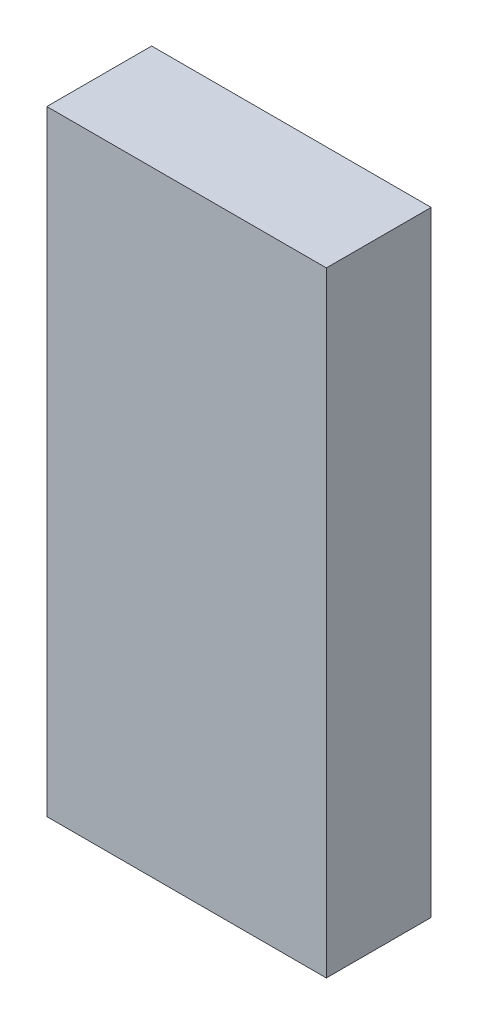
ISO-10303-21;
HEADER;
FILE_DESCRIPTION(('STEP AP214'),'2;1');
FILE_NAME('part.step','',(''),(''),'','','');
FILE_SCHEMA(('AUTOMOTIVE_DESIGN { 1 0 10303 214 1 1 1 1 }'));
ENDSEC;
DATA;
#1=APPLICATION_CONTEXT('core data for automotive mechanical design processes');
#2=APPLICATION_PROTOCOL_DEFINITION('international standard','automotive_design',2000,#1);
#3=PRODUCT_CONTEXT('',#1,'mechanical');
#4=PRODUCT('Part','Part','',(#3));
#5=PRODUCT_RELATED_PRODUCT_CATEGORY('part','',(#4));
#6=PRODUCT_DEFINITION_FORMATION('','',#4);
#7=PRODUCT_DEFINITION_CONTEXT('part definition',#1,'design');
#8=PRODUCT_DEFINITION('design','',#6,#7);
#9=PRODUCT_DEFINITION_SHAPE('','',#8);
#10=(LENGTH_UNIT() NAMED_UNIT(*) SI_UNIT(.MILLI.,.METRE.));
#11=(NAMED_UNIT(*) PLANE_ANGLE_UNIT() SI_UNIT($,.RADIAN.));
#12=(NAMED_UNIT(*) SI_UNIT($,.STERADIAN.) SOLID_ANGLE_UNIT());
#13=UNCERTAINTY_MEASURE_WITH_UNIT(LENGTH_MEASURE(1.E-05),#10,'distance_accuracy_value','');
#14=(GEOMETRIC_REPRESENTATION_CONTEXT(3) GLOBAL_UNCERTAINTY_ASSIGNED_CONTEXT((#13)) GLOBAL_UNIT_ASSIGNED_CONTEXT((#10,
#11,#12)) REPRESENTATION_CONTEXT('',''));
#15=CARTESIAN_POINT('',(0.,0.,0.));
#16=DIRECTION('',(0.,0.,1.));
#17=DIRECTION('',(1.,0.,0.));
#18=AXIS2_PLACEMENT_3D('',#15,#16,#17);
#19=CARTESIAN_POINT('',(-0.583606558012704,4.77383413269724,1.5));
#20=DIRECTION('',(1.,0.,0.));
#21=DIRECTION('',(0.,0.,-1.));
#22=AXIS2_PLACEMENT_3D('',#19,#20,#21);
#23=PLANE('',#22);
#24=DIRECTION('',(0.,-1.,0.));
#25=VECTOR('',#24,1.);
#26=CARTESIAN_POINT('',(-0.583606558012704,4.77383413269724,0.));
#27=LINE('',#26,#25);
#28=CARTESIAN_POINT('',(-0.583606558012704,4.77383413269724,0.));
#29=VERTEX_POINT('',#28);
#30=CARTESIAN_POINT('',(-0.583606558012704,-4.02616586730277,0.));
#31=VERTEX_POINT('',#30);
#32=EDGE_CURVE('E97',#29,#31,#27,.T.);
#33=ORIENTED_EDGE('',*,*,#32,.T.);
#34=DIRECTION('',(0.,0.,-1.));
#35=VECTOR('',#34,1.);
#36=CARTESIAN_POINT('',(-0.583606558012704,-4.02616586730277,1.5));
#37=LINE('',#36,#35);
#38=CARTESIAN_POINT('',(-0.583606558012704,-4.02616586730277,1.5));
#39=VERTEX_POINT('',#38);
#40=EDGE_CURVE('E11',#39,#31,#37,.T.);
#41=ORIENTED_EDGE('',*,*,#40,.F.);
#42=DIRECTION('',(0.,-1.,0.));
#43=VECTOR('',#42,1.);
#44=CARTESIAN_POINT('',(-0.583606558012704,4.77383413269724,1.5));
#45=LINE('',#44,#43);
#46=CARTESIAN_POINT('',(-0.583606558012704,4.77383413269724,1.5));
#47=VERTEX_POINT('',#46);
#48=EDGE_CURVE('E85',#47,#39,#45,.T.);
#49=ORIENTED_EDGE('',*,*,#48,.F.);
#50=DIRECTION('',(0.,0.,-1.));
#51=VECTOR('',#50,1.);
#52=CARTESIAN_POINT('',(-0.583606558012704,4.77383413269724,1.5));
#53=LINE('',#52,#51);
#54=EDGE_CURVE('E93',#47,#29,#53,.T.);
#55=ORIENTED_EDGE('',*,*,#54,.T.);
#56=EDGE_LOOP('',(#33,#41,#49,#55));
#57=FACE_BOUND('',#56,.T.);
#58=ADVANCED_FACE('F34',(#57),#23,.F.);
#59=CARTESIAN_POINT('',(-0.583606558012704,-4.02616586730277,1.5));
#60=DIRECTION('',(0.,1.,0.));
#61=DIRECTION('',(-1.,0.,0.));
#62=AXIS2_PLACEMENT_3D('',#59,#60,#61);
#63=PLANE('',#62);
#64=DIRECTION('',(1.,0.,0.));
#65=VECTOR('',#64,1.);
#66=CARTESIAN_POINT('',(-0.583606558012704,-4.02616586730277,0.));
#67=LINE('',#66,#65);
#68=CARTESIAN_POINT('',(3.4163934419873,-4.02616586730277,0.));
#69=VERTEX_POINT('',#68);
#70=EDGE_CURVE('E89',#31,#69,#67,.T.);
#71=ORIENTED_EDGE('',*,*,#70,.T.);
#72=DIRECTION('',(0.,0.,-1.));
#73=VECTOR('',#72,1.);
#74=CARTESIAN_POINT('',(3.4163934419873,-4.02616586730277,1.5));
#75=LINE('',#74,#73);
#76=CARTESIAN_POINT('',(3.4163934419873,-4.02616586730277,1.5));
#77=VERTEX_POINT('',#76);
#78=EDGE_CURVE('E42',#77,#69,#75,.T.);
#79=ORIENTED_EDGE('',*,*,#78,.F.);
#80=DIRECTION('',(1.,0.,0.));
#81=VECTOR('',#80,1.);
#82=CARTESIAN_POINT('',(-0.583606558012704,-4.02616586730277,1.5));
#83=LINE('',#82,#81);
#84=EDGE_CURVE('E80',#39,#77,#83,.T.);
#85=ORIENTED_EDGE('',*,*,#84,.F.);
#86=ORIENTED_EDGE('',*,*,#40,.T.);
#87=EDGE_LOOP('',(#71,#79,#85,#86));
#88=FACE_BOUND('',#87,.T.);
#89=ADVANCED_FACE('F88',(#88),#63,.F.);
#90=CARTESIAN_POINT('',(3.4163934419873,4.77383413269724,1.5));
#91=DIRECTION('',(-1.,0.,0.));
#92=DIRECTION('',(0.,0.,1.));
#93=AXIS2_PLACEMENT_3D('',#90,#91,#92);
#94=PLANE('',#93);
#95=DIRECTION('',(0.,1.,0.));
#96=VECTOR('',#95,1.);
#97=CARTESIAN_POINT('',(3.4163934419873,4.77383413269724,0.));
#98=LINE('',#97,#96);
#99=CARTESIAN_POINT('',(3.4163934419873,4.77383413269724,0.));
#100=VERTEX_POINT('',#99);
#101=EDGE_CURVE('E67',#69,#100,#98,.T.);
#102=ORIENTED_EDGE('',*,*,#101,.T.);
#103=DIRECTION('',(0.,0.,-1.));
#104=VECTOR('',#103,1.);
#105=CARTESIAN_POINT('',(3.4163934419873,4.77383413269724,1.5));
#106=LINE('',#105,#104);
#107=CARTESIAN_POINT('',(3.4163934419873,4.77383413269724,1.5));
#108=VERTEX_POINT('',#107);
#109=EDGE_CURVE('E90',#108,#100,#106,.T.);
#110=ORIENTED_EDGE('',*,*,#109,.F.);
#111=DIRECTION('',(0.,1.,0.));
#112=VECTOR('',#111,1.);
#113=CARTESIAN_POINT('',(3.4163934419873,4.77383413269724,1.5));
#114=LINE('',#113,#112);
#115=EDGE_CURVE('E83',#77,#108,#114,.T.);
#116=ORIENTED_EDGE('',*,*,#115,.F.);
#117=ORIENTED_EDGE('',*,*,#78,.T.);
#118=EDGE_LOOP('',(#102,#110,#116,#117));
#119=FACE_BOUND('',#118,.T.);
#120=ADVANCED_FACE('F91',(#119),#94,.F.);
#121=CARTESIAN_POINT('',(-0.583606558012704,4.77383413269724,1.5));
#122=DIRECTION('',(0.,-1.,0.));
#123=DIRECTION('',(0.,0.,-1.));
#124=AXIS2_PLACEMENT_3D('',#121,#122,#123);
#125=PLANE('',#124);
#126=DIRECTION('',(-1.,0.,0.));
#127=VECTOR('',#126,1.);
#128=CARTESIAN_POINT('',(-0.583606558012704,4.77383413269724,0.));
#129=LINE('',#128,#127);
#130=EDGE_CURVE('E73',#100,#29,#129,.T.);
#131=ORIENTED_EDGE('',*,*,#130,.T.);
#132=ORIENTED_EDGE('',*,*,#54,.F.);
#133=DIRECTION('',(-1.,0.,0.));
#134=VECTOR('',#133,1.);
#135=CARTESIAN_POINT('',(-0.583606558012704,4.77383413269724,1.5));
#136=LINE('',#135,#134);
#137=EDGE_CURVE('E50',#108,#47,#136,.T.);
#138=ORIENTED_EDGE('',*,*,#137,.F.);
#139=ORIENTED_EDGE('',*,*,#109,.T.);
#140=EDGE_LOOP('',(#131,#132,#138,#139));
#141=FACE_BOUND('',#140,.T.);
#142=ADVANCED_FACE('F104',(#141),#125,.F.);
#143=CARTESIAN_POINT('',(0.,0.,1.5));
#144=DIRECTION('',(0.,0.,1.));
#145=DIRECTION('',(1.,0.,0.));
#146=AXIS2_PLACEMENT_3D('',#143,#144,#145);
#147=PLANE('',#146);
#148=ORIENTED_EDGE('',*,*,#48,.T.);
#149=ORIENTED_EDGE('',*,*,#84,.T.);
#150=ORIENTED_EDGE('',*,*,#115,.T.);
#151=ORIENTED_EDGE('',*,*,#137,.T.);
#152=EDGE_LOOP('',(#148,#149,#150,#151));
#153=FACE_BOUND('',#152,.T.);
#154=ADVANCED_FACE('F81',(#153),#147,.T.);
#155=CARTESIAN_POINT('',(0.,0.,0.));
#156=DIRECTION('',(0.,0.,1.));
#157=DIRECTION('',(1.,0.,0.));
#158=AXIS2_PLACEMENT_3D('',#155,#156,#157);
#159=PLANE('',#158);
#160=ORIENTED_EDGE('',*,*,#32,.F.);
#161=ORIENTED_EDGE('',*,*,#130,.F.);
#162=ORIENTED_EDGE('',*,*,#101,.F.);
#163=ORIENTED_EDGE('',*,*,#70,.F.);
#164=EDGE_LOOP('',(#160,#161,#162,#163));
#165=FACE_BOUND('',#164,.T.);
#166=ADVANCED_FACE('F107',(#165),#159,.F.);
#167=CLOSED_SHELL('',(#58,#89,#120,#142,#154,#166));
#168=MANIFOLD_SOLID_BREP('B2',#167);
#169=ADVANCED_BREP_SHAPE_REPRESENTATION('',(#18,#168),#14);
#170=SHAPE_DEFINITION_REPRESENTATION(#9,#169);
ENDSEC;
END-ISO-10303-21;
